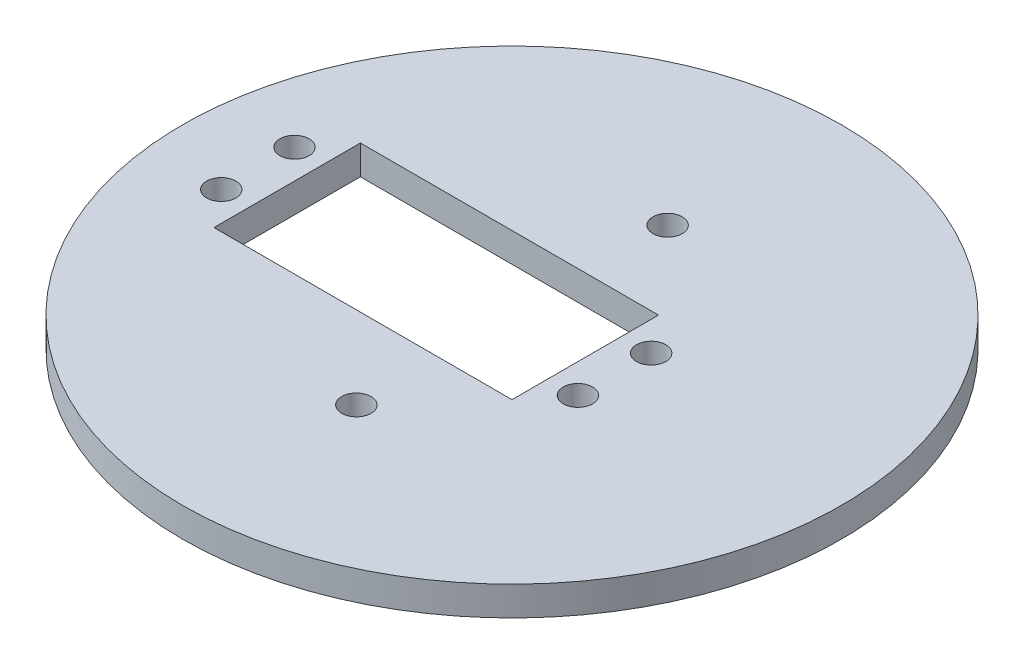
ISO-10303-21;
HEADER;
FILE_DESCRIPTION(('STEP AP214'),'2;1');
FILE_NAME('part.step','',(''),(''),'','','');
FILE_SCHEMA(('AUTOMOTIVE_DESIGN { 1 0 10303 214 1 1 1 1 }'));
ENDSEC;
DATA;
#1=APPLICATION_CONTEXT('core data for automotive mechanical design processes');
#2=APPLICATION_PROTOCOL_DEFINITION('international standard','automotive_design',2000,#1);
#3=PRODUCT_CONTEXT('',#1,'mechanical');
#4=PRODUCT('Part','Part','',(#3));
#5=PRODUCT_RELATED_PRODUCT_CATEGORY('part','',(#4));
#6=PRODUCT_DEFINITION_FORMATION('','',#4);
#7=PRODUCT_DEFINITION_CONTEXT('part definition',#1,'design');
#8=PRODUCT_DEFINITION('design','',#6,#7);
#9=PRODUCT_DEFINITION_SHAPE('','',#8);
#10=(LENGTH_UNIT() NAMED_UNIT(*) SI_UNIT(.MILLI.,.METRE.));
#11=(NAMED_UNIT(*) PLANE_ANGLE_UNIT() SI_UNIT($,.RADIAN.));
#12=(NAMED_UNIT(*) SI_UNIT($,.STERADIAN.) SOLID_ANGLE_UNIT());
#13=UNCERTAINTY_MEASURE_WITH_UNIT(LENGTH_MEASURE(1.E-05),#10,'distance_accuracy_value','');
#14=(GEOMETRIC_REPRESENTATION_CONTEXT(3) GLOBAL_UNCERTAINTY_ASSIGNED_CONTEXT((#13)) GLOBAL_UNIT_ASSIGNED_CONTEXT((#10,
#11,#12)) REPRESENTATION_CONTEXT('',''));
#15=CARTESIAN_POINT('',(0.,0.,0.));
#16=DIRECTION('',(0.,0.,1.));
#17=DIRECTION('',(1.,0.,0.));
#18=AXIS2_PLACEMENT_3D('',#15,#16,#17);
#19=CARTESIAN_POINT('',(0.,2.,0.));
#20=DIRECTION('',(0.,-1.,0.));
#21=DIRECTION('',(0.,0.,-1.));
#22=AXIS2_PLACEMENT_3D('',#19,#20,#21);
#23=CYLINDRICAL_SURFACE('',#22,45.);
#24=CARTESIAN_POINT('',(0.,2.,0.));
#25=DIRECTION('',(0.,1.,0.));
#26=DIRECTION('',(0.,0.,1.));
#27=AXIS2_PLACEMENT_3D('',#24,#25,#26);
#28=CIRCLE('',#27,45.);
#29=CARTESIAN_POINT('',(0.,2.,45.));
#30=VERTEX_POINT('',#29);
#31=EDGE_CURVE('E103',#30,#30,#28,.T.);
#32=ORIENTED_EDGE('',*,*,#31,.F.);
#33=EDGE_LOOP('',(#32));
#34=FACE_BOUND('',#33,.T.);
#35=CARTESIAN_POINT('',(0.,-2.,0.));
#36=DIRECTION('',(0.,1.,0.));
#37=DIRECTION('',(0.,0.,1.));
#38=AXIS2_PLACEMENT_3D('',#35,#36,#37);
#39=CIRCLE('',#38,45.);
#40=CARTESIAN_POINT('',(0.,-2.,45.));
#41=VERTEX_POINT('',#40);
#42=EDGE_CURVE('E100',#41,#41,#39,.T.);
#43=ORIENTED_EDGE('',*,*,#42,.T.);
#44=EDGE_LOOP('',(#43));
#45=FACE_BOUND('',#44,.T.);
#46=ADVANCED_FACE('F32',(#34,#45),#23,.T.);
#47=CARTESIAN_POINT('',(0.,2.,0.));
#48=DIRECTION('',(0.,1.,0.));
#49=DIRECTION('',(0.,0.,1.));
#50=AXIS2_PLACEMENT_3D('',#47,#48,#49);
#51=PLANE('',#50);
#52=CARTESIAN_POINT('',(14.,2.,4.99999999999995));
#53=DIRECTION('',(0.,1.,0.));
#54=DIRECTION('',(0.,0.,1.));
#55=AXIS2_PLACEMENT_3D('',#52,#53,#54);
#56=CIRCLE('',#55,2.);
#57=CARTESIAN_POINT('',(14.,2.,6.99999999999996));
#58=VERTEX_POINT('',#57);
#59=EDGE_CURVE('E140',#58,#58,#56,.T.);
#60=ORIENTED_EDGE('',*,*,#59,.F.);
#61=EDGE_LOOP('',(#60));
#62=FACE_BOUND('',#61,.T.);
#63=CARTESIAN_POINT('',(14.,2.,-5.00000000000005));
#64=DIRECTION('',(0.,1.,0.));
#65=DIRECTION('',(0.,0.,1.));
#66=AXIS2_PLACEMENT_3D('',#63,#64,#65);
#67=CIRCLE('',#66,2.);
#68=CARTESIAN_POINT('',(14.,2.,-3.00000000000005));
#69=VERTEX_POINT('',#68);
#70=EDGE_CURVE('E130',#69,#69,#67,.T.);
#71=ORIENTED_EDGE('',*,*,#70,.F.);
#72=EDGE_LOOP('',(#71));
#73=FACE_BOUND('',#72,.T.);
#74=CARTESIAN_POINT('',(0.,2.,-21.25));
#75=DIRECTION('',(0.,1.,0.));
#76=DIRECTION('',(0.,0.,1.));
#77=AXIS2_PLACEMENT_3D('',#74,#75,#76);
#78=CIRCLE('',#77,2.);
#79=CARTESIAN_POINT('',(0.,2.,-19.25));
#80=VERTEX_POINT('',#79);
#81=EDGE_CURVE('E127',#80,#80,#78,.T.);
#82=ORIENTED_EDGE('',*,*,#81,.F.);
#83=EDGE_LOOP('',(#82));
#84=FACE_BOUND('',#83,.T.);
#85=CARTESIAN_POINT('',(0.,2.,21.25));
#86=DIRECTION('',(0.,1.,0.));
#87=DIRECTION('',(0.,0.,1.));
#88=AXIS2_PLACEMENT_3D('',#85,#86,#87);
#89=CIRCLE('',#88,2.);
#90=CARTESIAN_POINT('',(0.,2.,23.25));
#91=VERTEX_POINT('',#90);
#92=EDGE_CURVE('E124',#91,#91,#89,.T.);
#93=ORIENTED_EDGE('',*,*,#92,.F.);
#94=EDGE_LOOP('',(#93));
#95=FACE_BOUND('',#94,.T.);
#96=CARTESIAN_POINT('',(-34.7,2.,4.99999999999995));
#97=DIRECTION('',(0.,1.,0.));
#98=DIRECTION('',(0.,0.,1.));
#99=AXIS2_PLACEMENT_3D('',#96,#97,#98);
#100=CIRCLE('',#99,2.);
#101=CARTESIAN_POINT('',(-34.7,2.,6.99999999999996));
#102=VERTEX_POINT('',#101);
#103=EDGE_CURVE('E120',#102,#102,#100,.T.);
#104=ORIENTED_EDGE('',*,*,#103,.F.);
#105=EDGE_LOOP('',(#104));
#106=FACE_BOUND('',#105,.T.);
#107=CARTESIAN_POINT('',(-34.7,2.,-5.00000000000005));
#108=DIRECTION('',(0.,1.,0.));
#109=DIRECTION('',(0.,0.,1.));
#110=AXIS2_PLACEMENT_3D('',#107,#108,#109);
#111=CIRCLE('',#110,2.);
#112=CARTESIAN_POINT('',(-34.7,2.,-3.00000000000005));
#113=VERTEX_POINT('',#112);
#114=EDGE_CURVE('E116',#113,#113,#111,.T.);
#115=ORIENTED_EDGE('',*,*,#114,.F.);
#116=EDGE_LOOP('',(#115));
#117=FACE_BOUND('',#116,.T.);
#118=DIRECTION('',(0.,0.,1.));
#119=VECTOR('',#118,1.);
#120=CARTESIAN_POINT('',(-30.7,2.,-10.));
#121=LINE('',#120,#119);
#122=CARTESIAN_POINT('',(-30.7,2.,-10.));
#123=VERTEX_POINT('',#122);
#124=CARTESIAN_POINT('',(-30.7,2.,9.99999999999996));
#125=VERTEX_POINT('',#124);
#126=EDGE_CURVE('E48',#123,#125,#121,.T.);
#127=ORIENTED_EDGE('',*,*,#126,.F.);
#128=DIRECTION('',(-1.,0.,0.));
#129=VECTOR('',#128,1.);
#130=CARTESIAN_POINT('',(-30.7,2.,-10.));
#131=LINE('',#130,#129);
#132=CARTESIAN_POINT('',(9.99999999999999,2.,-10.));
#133=VERTEX_POINT('',#132);
#134=EDGE_CURVE('E93',#133,#123,#131,.T.);
#135=ORIENTED_EDGE('',*,*,#134,.F.);
#136=DIRECTION('',(0.,0.,-1.));
#137=VECTOR('',#136,1.);
#138=CARTESIAN_POINT('',(9.99999999999999,2.,-10.));
#139=LINE('',#138,#137);
#140=CARTESIAN_POINT('',(9.99999999999999,2.,9.99999999999996));
#141=VERTEX_POINT('',#140);
#142=EDGE_CURVE('E77',#141,#133,#139,.T.);
#143=ORIENTED_EDGE('',*,*,#142,.F.);
#144=DIRECTION('',(1.,0.,0.));
#145=VECTOR('',#144,1.);
#146=CARTESIAN_POINT('',(-30.7,2.,9.99999999999996));
#147=LINE('',#146,#145);
#148=EDGE_CURVE('E86',#125,#141,#147,.T.);
#149=ORIENTED_EDGE('',*,*,#148,.F.);
#150=EDGE_LOOP('',(#127,#135,#143,#149));
#151=FACE_BOUND('',#150,.T.);
#152=ORIENTED_EDGE('',*,*,#31,.T.);
#153=EDGE_LOOP('',(#152));
#154=FACE_BOUND('',#153,.T.);
#155=ADVANCED_FACE('F90',(#62,#73,#84,#95,#106,#117,#151,#154),#51,.T.);
#156=CARTESIAN_POINT('',(0.,-2.,0.));
#157=DIRECTION('',(0.,1.,0.));
#158=DIRECTION('',(0.,0.,1.));
#159=AXIS2_PLACEMENT_3D('',#156,#157,#158);
#160=PLANE('',#159);
#161=CARTESIAN_POINT('',(14.,-2.,4.99999999999995));
#162=DIRECTION('',(0.,1.,0.));
#163=DIRECTION('',(0.,0.,1.));
#164=AXIS2_PLACEMENT_3D('',#161,#162,#163);
#165=CIRCLE('',#164,2.);
#166=CARTESIAN_POINT('',(14.,-2.,6.99999999999996));
#167=VERTEX_POINT('',#166);
#168=EDGE_CURVE('E35',#167,#167,#165,.T.);
#169=ORIENTED_EDGE('',*,*,#168,.T.);
#170=EDGE_LOOP('',(#169));
#171=FACE_BOUND('',#170,.T.);
#172=CARTESIAN_POINT('',(14.,-2.,-5.00000000000005));
#173=DIRECTION('',(0.,1.,0.));
#174=DIRECTION('',(0.,0.,1.));
#175=AXIS2_PLACEMENT_3D('',#172,#173,#174);
#176=CIRCLE('',#175,2.);
#177=CARTESIAN_POINT('',(14.,-2.,-3.00000000000005));
#178=VERTEX_POINT('',#177);
#179=EDGE_CURVE('E128',#178,#178,#176,.T.);
#180=ORIENTED_EDGE('',*,*,#179,.T.);
#181=EDGE_LOOP('',(#180));
#182=FACE_BOUND('',#181,.T.);
#183=CARTESIAN_POINT('',(0.,-2.,-21.25));
#184=DIRECTION('',(0.,1.,0.));
#185=DIRECTION('',(0.,0.,1.));
#186=AXIS2_PLACEMENT_3D('',#183,#184,#185);
#187=CIRCLE('',#186,2.);
#188=CARTESIAN_POINT('',(0.,-2.,-19.25));
#189=VERTEX_POINT('',#188);
#190=EDGE_CURVE('E125',#189,#189,#187,.T.);
#191=ORIENTED_EDGE('',*,*,#190,.T.);
#192=EDGE_LOOP('',(#191));
#193=FACE_BOUND('',#192,.T.);
#194=CARTESIAN_POINT('',(0.,-2.,21.25));
#195=DIRECTION('',(0.,1.,0.));
#196=DIRECTION('',(0.,0.,1.));
#197=AXIS2_PLACEMENT_3D('',#194,#195,#196);
#198=CIRCLE('',#197,2.);
#199=CARTESIAN_POINT('',(0.,-2.,23.25));
#200=VERTEX_POINT('',#199);
#201=EDGE_CURVE('E121',#200,#200,#198,.T.);
#202=ORIENTED_EDGE('',*,*,#201,.T.);
#203=EDGE_LOOP('',(#202));
#204=FACE_BOUND('',#203,.T.);
#205=CARTESIAN_POINT('',(-34.7,-2.,4.99999999999995));
#206=DIRECTION('',(0.,1.,0.));
#207=DIRECTION('',(0.,0.,1.));
#208=AXIS2_PLACEMENT_3D('',#205,#206,#207);
#209=CIRCLE('',#208,2.);
#210=CARTESIAN_POINT('',(-34.7,-2.,6.99999999999996));
#211=VERTEX_POINT('',#210);
#212=EDGE_CURVE('E117',#211,#211,#209,.T.);
#213=ORIENTED_EDGE('',*,*,#212,.T.);
#214=EDGE_LOOP('',(#213));
#215=FACE_BOUND('',#214,.T.);
#216=CARTESIAN_POINT('',(-34.7,-2.,-5.00000000000005));
#217=DIRECTION('',(0.,1.,0.));
#218=DIRECTION('',(0.,0.,1.));
#219=AXIS2_PLACEMENT_3D('',#216,#217,#218);
#220=CIRCLE('',#219,2.);
#221=CARTESIAN_POINT('',(-34.7,-2.,-3.00000000000005));
#222=VERTEX_POINT('',#221);
#223=EDGE_CURVE('E113',#222,#222,#220,.T.);
#224=ORIENTED_EDGE('',*,*,#223,.T.);
#225=EDGE_LOOP('',(#224));
#226=FACE_BOUND('',#225,.T.);
#227=DIRECTION('',(-1.,0.,0.));
#228=VECTOR('',#227,1.);
#229=CARTESIAN_POINT('',(0.,-2.,-10.));
#230=LINE('',#229,#228);
#231=CARTESIAN_POINT('',(9.99999999999999,-2.,-10.));
#232=VERTEX_POINT('',#231);
#233=CARTESIAN_POINT('',(-30.7,-2.,-10.));
#234=VERTEX_POINT('',#233);
#235=EDGE_CURVE('E40',#232,#234,#230,.T.);
#236=ORIENTED_EDGE('',*,*,#235,.T.);
#237=DIRECTION('',(0.,0.,1.));
#238=VECTOR('',#237,1.);
#239=CARTESIAN_POINT('',(-30.7,-2.,0.));
#240=LINE('',#239,#238);
#241=CARTESIAN_POINT('',(-30.7,-2.,9.99999999999996));
#242=VERTEX_POINT('',#241);
#243=EDGE_CURVE('E11',#234,#242,#240,.T.);
#244=ORIENTED_EDGE('',*,*,#243,.T.);
#245=DIRECTION('',(1.,0.,0.));
#246=VECTOR('',#245,1.);
#247=CARTESIAN_POINT('',(0.,-2.,9.99999999999996));
#248=LINE('',#247,#246);
#249=CARTESIAN_POINT('',(9.99999999999999,-2.,9.99999999999996));
#250=VERTEX_POINT('',#249);
#251=EDGE_CURVE('E106',#242,#250,#248,.T.);
#252=ORIENTED_EDGE('',*,*,#251,.T.);
#253=DIRECTION('',(0.,0.,-1.));
#254=VECTOR('',#253,1.);
#255=CARTESIAN_POINT('',(9.99999999999999,-2.,0.));
#256=LINE('',#255,#254);
#257=EDGE_CURVE('E80',#250,#232,#256,.T.);
#258=ORIENTED_EDGE('',*,*,#257,.T.);
#259=EDGE_LOOP('',(#236,#244,#252,#258));
#260=FACE_BOUND('',#259,.T.);
#261=ORIENTED_EDGE('',*,*,#42,.F.);
#262=EDGE_LOOP('',(#261));
#263=FACE_BOUND('',#262,.T.);
#264=ADVANCED_FACE('F154',(#171,#182,#193,#204,#215,#226,#260,#263),#160,.F.);
#265=CARTESIAN_POINT('',(-30.7,-8.,-10.));
#266=DIRECTION('',(-1.,0.,0.));
#267=DIRECTION('',(0.,0.,1.));
#268=AXIS2_PLACEMENT_3D('',#265,#266,#267);
#269=PLANE('',#268);
#270=DIRECTION('',(0.,1.,0.));
#271=VECTOR('',#270,1.);
#272=CARTESIAN_POINT('',(-30.7,-8.,-10.));
#273=LINE('',#272,#271);
#274=EDGE_CURVE('E98',#234,#123,#273,.T.);
#275=ORIENTED_EDGE('',*,*,#274,.T.);
#276=ORIENTED_EDGE('',*,*,#126,.T.);
#277=DIRECTION('',(0.,1.,0.));
#278=VECTOR('',#277,1.);
#279=CARTESIAN_POINT('',(-30.7,-8.,9.99999999999996));
#280=LINE('',#279,#278);
#281=EDGE_CURVE('E83',#242,#125,#280,.T.);
#282=ORIENTED_EDGE('',*,*,#281,.F.);
#283=ORIENTED_EDGE('',*,*,#243,.F.);
#284=EDGE_LOOP('',(#275,#276,#282,#283));
#285=FACE_BOUND('',#284,.T.);
#286=ADVANCED_FACE('F161',(#285),#269,.F.);
#287=CARTESIAN_POINT('',(-30.7,-8.,-10.));
#288=DIRECTION('',(0.,0.,-1.));
#289=DIRECTION('',(-1.,0.,0.));
#290=AXIS2_PLACEMENT_3D('',#287,#288,#289);
#291=PLANE('',#290);
#292=DIRECTION('',(0.,1.,0.));
#293=VECTOR('',#292,1.);
#294=CARTESIAN_POINT('',(9.99999999999999,-8.,-10.));
#295=LINE('',#294,#293);
#296=EDGE_CURVE('E82',#232,#133,#295,.T.);
#297=ORIENTED_EDGE('',*,*,#296,.T.);
#298=ORIENTED_EDGE('',*,*,#134,.T.);
#299=ORIENTED_EDGE('',*,*,#274,.F.);
#300=ORIENTED_EDGE('',*,*,#235,.F.);
#301=EDGE_LOOP('',(#297,#298,#299,#300));
#302=FACE_BOUND('',#301,.T.);
#303=ADVANCED_FACE('F169',(#302),#291,.F.);
#304=CARTESIAN_POINT('',(9.99999999999999,-8.,-10.));
#305=DIRECTION('',(1.,0.,0.));
#306=DIRECTION('',(0.,0.,-1.));
#307=AXIS2_PLACEMENT_3D('',#304,#305,#306);
#308=PLANE('',#307);
#309=DIRECTION('',(0.,1.,0.));
#310=VECTOR('',#309,1.);
#311=CARTESIAN_POINT('',(9.99999999999999,-8.,9.99999999999996));
#312=LINE('',#311,#310);
#313=EDGE_CURVE('E56',#250,#141,#312,.T.);
#314=ORIENTED_EDGE('',*,*,#313,.T.);
#315=ORIENTED_EDGE('',*,*,#142,.T.);
#316=ORIENTED_EDGE('',*,*,#296,.F.);
#317=ORIENTED_EDGE('',*,*,#257,.F.);
#318=EDGE_LOOP('',(#314,#315,#316,#317));
#319=FACE_BOUND('',#318,.T.);
#320=ADVANCED_FACE('F74',(#319),#308,.F.);
#321=CARTESIAN_POINT('',(-30.7,-8.,9.99999999999996));
#322=DIRECTION('',(0.,0.,1.));
#323=DIRECTION('',(1.,0.,0.));
#324=AXIS2_PLACEMENT_3D('',#321,#322,#323);
#325=PLANE('',#324);
#326=ORIENTED_EDGE('',*,*,#281,.T.);
#327=ORIENTED_EDGE('',*,*,#148,.T.);
#328=ORIENTED_EDGE('',*,*,#313,.F.);
#329=ORIENTED_EDGE('',*,*,#251,.F.);
#330=EDGE_LOOP('',(#326,#327,#328,#329));
#331=FACE_BOUND('',#330,.T.);
#332=ADVANCED_FACE('F87',(#331),#325,.F.);
#333=CARTESIAN_POINT('',(-34.7,-8.,-5.00000000000005));
#334=DIRECTION('',(0.,1.,0.));
#335=DIRECTION('',(0.,0.,1.));
#336=AXIS2_PLACEMENT_3D('',#333,#334,#335);
#337=CYLINDRICAL_SURFACE('',#336,2.);
#338=ORIENTED_EDGE('',*,*,#114,.T.);
#339=EDGE_LOOP('',(#338));
#340=FACE_BOUND('',#339,.T.);
#341=ORIENTED_EDGE('',*,*,#223,.F.);
#342=EDGE_LOOP('',(#341));
#343=FACE_BOUND('',#342,.T.);
#344=ADVANCED_FACE('F150',(#340,#343),#337,.F.);
#345=CARTESIAN_POINT('',(-34.7,-8.,4.99999999999995));
#346=DIRECTION('',(0.,1.,0.));
#347=DIRECTION('',(0.,0.,1.));
#348=AXIS2_PLACEMENT_3D('',#345,#346,#347);
#349=CYLINDRICAL_SURFACE('',#348,2.);
#350=ORIENTED_EDGE('',*,*,#103,.T.);
#351=EDGE_LOOP('',(#350));
#352=FACE_BOUND('',#351,.T.);
#353=ORIENTED_EDGE('',*,*,#212,.F.);
#354=EDGE_LOOP('',(#353));
#355=FACE_BOUND('',#354,.T.);
#356=ADVANCED_FACE('F179',(#352,#355),#349,.F.);
#357=CARTESIAN_POINT('',(0.,-8.,21.25));
#358=DIRECTION('',(0.,1.,0.));
#359=DIRECTION('',(0.,0.,1.));
#360=AXIS2_PLACEMENT_3D('',#357,#358,#359);
#361=CYLINDRICAL_SURFACE('',#360,2.);
#362=ORIENTED_EDGE('',*,*,#92,.T.);
#363=EDGE_LOOP('',(#362));
#364=FACE_BOUND('',#363,.T.);
#365=ORIENTED_EDGE('',*,*,#201,.F.);
#366=EDGE_LOOP('',(#365));
#367=FACE_BOUND('',#366,.T.);
#368=ADVANCED_FACE('F182',(#364,#367),#361,.F.);
#369=CARTESIAN_POINT('',(0.,-8.,-21.25));
#370=DIRECTION('',(0.,1.,0.));
#371=DIRECTION('',(0.,0.,1.));
#372=AXIS2_PLACEMENT_3D('',#369,#370,#371);
#373=CYLINDRICAL_SURFACE('',#372,2.);
#374=ORIENTED_EDGE('',*,*,#81,.T.);
#375=EDGE_LOOP('',(#374));
#376=FACE_BOUND('',#375,.T.);
#377=ORIENTED_EDGE('',*,*,#190,.F.);
#378=EDGE_LOOP('',(#377));
#379=FACE_BOUND('',#378,.T.);
#380=ADVANCED_FACE('F186',(#376,#379),#373,.F.);
#381=CARTESIAN_POINT('',(14.,-8.,-5.00000000000005));
#382=DIRECTION('',(0.,1.,0.));
#383=DIRECTION('',(0.,0.,1.));
#384=AXIS2_PLACEMENT_3D('',#381,#382,#383);
#385=CYLINDRICAL_SURFACE('',#384,2.);
#386=ORIENTED_EDGE('',*,*,#70,.T.);
#387=EDGE_LOOP('',(#386));
#388=FACE_BOUND('',#387,.T.);
#389=ORIENTED_EDGE('',*,*,#179,.F.);
#390=EDGE_LOOP('',(#389));
#391=FACE_BOUND('',#390,.T.);
#392=ADVANCED_FACE('F190',(#388,#391),#385,.F.);
#393=CARTESIAN_POINT('',(14.,-8.,4.99999999999995));
#394=DIRECTION('',(0.,1.,0.));
#395=DIRECTION('',(0.,0.,1.));
#396=AXIS2_PLACEMENT_3D('',#393,#394,#395);
#397=CYLINDRICAL_SURFACE('',#396,2.);
#398=ORIENTED_EDGE('',*,*,#59,.T.);
#399=EDGE_LOOP('',(#398));
#400=FACE_BOUND('',#399,.T.);
#401=ORIENTED_EDGE('',*,*,#168,.F.);
#402=EDGE_LOOP('',(#401));
#403=FACE_BOUND('',#402,.T.);
#404=ADVANCED_FACE('F194',(#400,#403),#397,.F.);
#405=CLOSED_SHELL('',(#46,#155,#264,#286,#303,#320,#332,#344,#356,#368,#380,#392,#404));
#406=MANIFOLD_SOLID_BREP('B2',#405);
#407=ADVANCED_BREP_SHAPE_REPRESENTATION('',(#18,#406),#14);
#408=SHAPE_DEFINITION_REPRESENTATION(#9,#407);
ENDSEC;
END-ISO-10303-21;
